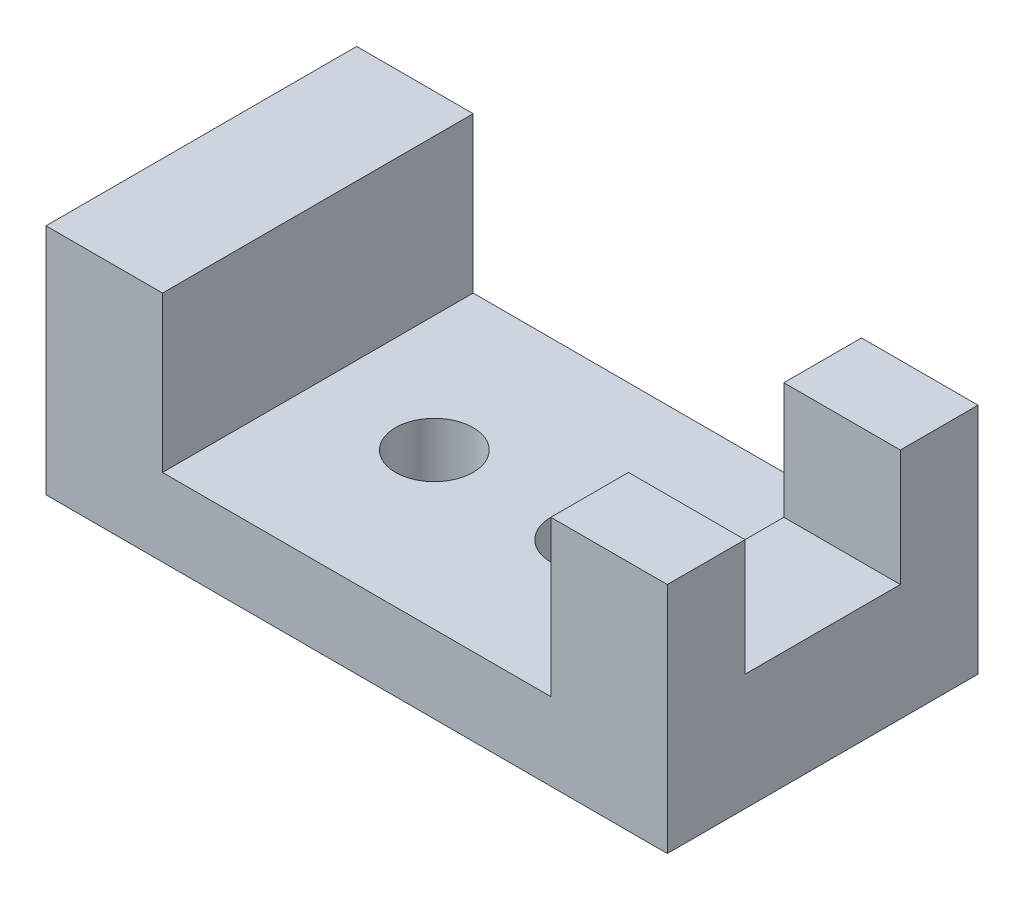
ISO-10303-21;
HEADER;
FILE_DESCRIPTION(('STEP AP214'),'2;1');
FILE_NAME('part.step','',(''),(''),'','','');
FILE_SCHEMA(('AUTOMOTIVE_DESIGN { 1 0 10303 214 1 1 1 1 }'));
ENDSEC;
DATA;
#1=APPLICATION_CONTEXT('core data for automotive mechanical design processes');
#2=APPLICATION_PROTOCOL_DEFINITION('international standard','automotive_design',2000,#1);
#3=PRODUCT_CONTEXT('',#1,'mechanical');
#4=PRODUCT('Part','Part','',(#3));
#5=PRODUCT_RELATED_PRODUCT_CATEGORY('part','',(#4));
#6=PRODUCT_DEFINITION_FORMATION('','',#4);
#7=PRODUCT_DEFINITION_CONTEXT('part definition',#1,'design');
#8=PRODUCT_DEFINITION('design','',#6,#7);
#9=PRODUCT_DEFINITION_SHAPE('','',#8);
#10=(LENGTH_UNIT() NAMED_UNIT(*) SI_UNIT(.MILLI.,.METRE.));
#11=(NAMED_UNIT(*) PLANE_ANGLE_UNIT() SI_UNIT($,.RADIAN.));
#12=(NAMED_UNIT(*) SI_UNIT($,.STERADIAN.) SOLID_ANGLE_UNIT());
#13=UNCERTAINTY_MEASURE_WITH_UNIT(LENGTH_MEASURE(1.E-05),#10,'distance_accuracy_value','');
#14=(GEOMETRIC_REPRESENTATION_CONTEXT(3) GLOBAL_UNCERTAINTY_ASSIGNED_CONTEXT((#13)) GLOBAL_UNIT_ASSIGNED_CONTEXT((#10,
#11,#12)) REPRESENTATION_CONTEXT('',''));
#15=CARTESIAN_POINT('',(0.,0.,0.));
#16=DIRECTION('',(0.,0.,1.));
#17=DIRECTION('',(1.,0.,0.));
#18=AXIS2_PLACEMENT_3D('',#15,#16,#17);
#19=CARTESIAN_POINT('',(0.,30.,13.5562625586068));
#20=DIRECTION('',(0.,0.,-1.));
#21=DIRECTION('',(-1.,0.,0.));
#22=AXIS2_PLACEMENT_3D('',#19,#20,#21);
#23=PLANE('',#22);
#24=DIRECTION('',(1.,0.,0.));
#25=VECTOR('',#24,1.);
#26=CARTESIAN_POINT('',(0.,0.,13.5562625586068));
#27=LINE('',#26,#25);
#28=CARTESIAN_POINT('',(-51.0683188211654,0.,13.5562625586068));
#29=VERTEX_POINT('',#28);
#30=CARTESIAN_POINT('',(28.9316811788346,0.,13.5562625586068));
#31=VERTEX_POINT('',#30);
#32=EDGE_CURVE('E203',#29,#31,#27,.T.);
#33=ORIENTED_EDGE('',*,*,#32,.F.);
#34=DIRECTION('',(0.,-1.,0.));
#35=VECTOR('',#34,1.);
#36=CARTESIAN_POINT('',(-51.0683188211654,30.,13.5562625586068));
#37=LINE('',#36,#35);
#38=CARTESIAN_POINT('',(-51.0683188211654,30.,13.5562625586068));
#39=VERTEX_POINT('',#38);
#40=EDGE_CURVE('E11',#39,#29,#37,.T.);
#41=ORIENTED_EDGE('',*,*,#40,.F.);
#42=DIRECTION('',(1.,0.,0.));
#43=VECTOR('',#42,1.);
#44=CARTESIAN_POINT('',(0.,30.,13.5562625586068));
#45=LINE('',#44,#43);
#46=CARTESIAN_POINT('',(-36.0683188211654,30.,13.5562625586068));
#47=VERTEX_POINT('',#46);
#48=EDGE_CURVE('E208',#39,#47,#45,.T.);
#49=ORIENTED_EDGE('',*,*,#48,.T.);
#50=DIRECTION('',(0.,-1.,0.));
#51=VECTOR('',#50,1.);
#52=CARTESIAN_POINT('',(-36.0683188211654,30.,13.5562625586068));
#53=LINE('',#52,#51);
#54=CARTESIAN_POINT('',(-36.0683188211654,10.,13.5562625586068));
#55=VERTEX_POINT('',#54);
#56=EDGE_CURVE('E52',#47,#55,#53,.T.);
#57=ORIENTED_EDGE('',*,*,#56,.T.);
#58=DIRECTION('',(1.,0.,0.));
#59=VECTOR('',#58,1.);
#60=CARTESIAN_POINT('',(0.,10.,13.5562625586068));
#61=LINE('',#60,#59);
#62=CARTESIAN_POINT('',(13.9316811788346,10.,13.5562625586068));
#63=VERTEX_POINT('',#62);
#64=EDGE_CURVE('E197',#55,#63,#61,.T.);
#65=ORIENTED_EDGE('',*,*,#64,.T.);
#66=DIRECTION('',(0.,-1.,0.));
#67=VECTOR('',#66,1.);
#68=CARTESIAN_POINT('',(13.9316811788346,30.,13.5562625586068));
#69=LINE('',#68,#67);
#70=CARTESIAN_POINT('',(13.9316811788346,30.,13.5562625586068));
#71=VERTEX_POINT('',#70);
#72=EDGE_CURVE('E235',#71,#63,#69,.T.);
#73=ORIENTED_EDGE('',*,*,#72,.F.);
#74=DIRECTION('',(1.,0.,0.));
#75=VECTOR('',#74,1.);
#76=CARTESIAN_POINT('',(0.,30.,13.5562625586068));
#77=LINE('',#76,#75);
#78=CARTESIAN_POINT('',(28.9316811788346,30.,13.5562625586068));
#79=VERTEX_POINT('',#78);
#80=EDGE_CURVE('E142',#71,#79,#77,.T.);
#81=ORIENTED_EDGE('',*,*,#80,.T.);
#82=DIRECTION('',(0.,-1.,0.));
#83=VECTOR('',#82,1.);
#84=CARTESIAN_POINT('',(28.9316811788346,30.,13.5562625586068));
#85=LINE('',#84,#83);
#86=EDGE_CURVE('E154',#79,#31,#85,.T.);
#87=ORIENTED_EDGE('',*,*,#86,.T.);
#88=EDGE_LOOP('',(#33,#41,#49,#57,#65,#73,#81,#87));
#89=FACE_BOUND('',#88,.T.);
#90=ADVANCED_FACE('F33',(#89),#23,.T.);
#91=CARTESIAN_POINT('',(-51.0683188211654,30.,0.));
#92=DIRECTION('',(-1.,0.,0.));
#93=DIRECTION('',(0.,0.,1.));
#94=AXIS2_PLACEMENT_3D('',#91,#92,#93);
#95=PLANE('',#94);
#96=DIRECTION('',(0.,0.,-1.));
#97=VECTOR('',#96,1.);
#98=CARTESIAN_POINT('',(-51.0683188211654,0.,0.));
#99=LINE('',#98,#97);
#100=CARTESIAN_POINT('',(-51.0683188211654,0.,53.5562625586068));
#101=VERTEX_POINT('',#100);
#102=EDGE_CURVE('E219',#101,#29,#99,.T.);
#103=ORIENTED_EDGE('',*,*,#102,.F.);
#104=DIRECTION('',(0.,-1.,0.));
#105=VECTOR('',#104,1.);
#106=CARTESIAN_POINT('',(-51.0683188211654,30.,53.5562625586068));
#107=LINE('',#106,#105);
#108=CARTESIAN_POINT('',(-51.0683188211654,30.,53.5562625586068));
#109=VERTEX_POINT('',#108);
#110=EDGE_CURVE('E40',#109,#101,#107,.T.);
#111=ORIENTED_EDGE('',*,*,#110,.F.);
#112=DIRECTION('',(0.,0.,-1.));
#113=VECTOR('',#112,1.);
#114=CARTESIAN_POINT('',(-51.0683188211654,30.,0.));
#115=LINE('',#114,#113);
#116=EDGE_CURVE('E210',#109,#39,#115,.T.);
#117=ORIENTED_EDGE('',*,*,#116,.T.);
#118=ORIENTED_EDGE('',*,*,#40,.T.);
#119=EDGE_LOOP('',(#103,#111,#117,#118));
#120=FACE_BOUND('',#119,.T.);
#121=ADVANCED_FACE('F249',(#120),#95,.T.);
#122=CARTESIAN_POINT('',(0.,30.,53.5562625586068));
#123=DIRECTION('',(0.,0.,-1.));
#124=DIRECTION('',(-1.,0.,0.));
#125=AXIS2_PLACEMENT_3D('',#122,#123,#124);
#126=PLANE('',#125);
#127=DIRECTION('',(1.,0.,0.));
#128=VECTOR('',#127,1.);
#129=CARTESIAN_POINT('',(0.,0.,53.5562625586068));
#130=LINE('',#129,#128);
#131=CARTESIAN_POINT('',(28.9316811788346,0.,53.5562625586068));
#132=VERTEX_POINT('',#131);
#133=EDGE_CURVE('E211',#101,#132,#130,.T.);
#134=ORIENTED_EDGE('',*,*,#133,.T.);
#135=DIRECTION('',(0.,-1.,0.));
#136=VECTOR('',#135,1.);
#137=CARTESIAN_POINT('',(28.9316811788346,30.,53.5562625586068));
#138=LINE('',#137,#136);
#139=CARTESIAN_POINT('',(28.9316811788346,30.,53.5562625586068));
#140=VERTEX_POINT('',#139);
#141=EDGE_CURVE('E178',#140,#132,#138,.T.);
#142=ORIENTED_EDGE('',*,*,#141,.F.);
#143=DIRECTION('',(1.,0.,0.));
#144=VECTOR('',#143,1.);
#145=CARTESIAN_POINT('',(0.,30.,53.5562625586068));
#146=LINE('',#145,#144);
#147=CARTESIAN_POINT('',(13.9316811788346,30.,53.5562625586068));
#148=VERTEX_POINT('',#147);
#149=EDGE_CURVE('E170',#148,#140,#146,.T.);
#150=ORIENTED_EDGE('',*,*,#149,.F.);
#151=DIRECTION('',(0.,-1.,0.));
#152=VECTOR('',#151,1.);
#153=CARTESIAN_POINT('',(13.9316811788346,30.,53.5562625586068));
#154=LINE('',#153,#152);
#155=CARTESIAN_POINT('',(13.9316811788346,10.,53.5562625586068));
#156=VERTEX_POINT('',#155);
#157=EDGE_CURVE('E181',#148,#156,#154,.T.);
#158=ORIENTED_EDGE('',*,*,#157,.T.);
#159=DIRECTION('',(1.,0.,0.));
#160=VECTOR('',#159,1.);
#161=CARTESIAN_POINT('',(0.,10.,53.5562625586068));
#162=LINE('',#161,#160);
#163=CARTESIAN_POINT('',(-36.0683188211654,10.,53.5562625586068));
#164=VERTEX_POINT('',#163);
#165=EDGE_CURVE('E201',#164,#156,#162,.T.);
#166=ORIENTED_EDGE('',*,*,#165,.F.);
#167=DIRECTION('',(0.,-1.,0.));
#168=VECTOR('',#167,1.);
#169=CARTESIAN_POINT('',(-36.0683188211654,30.,53.5562625586068));
#170=LINE('',#169,#168);
#171=CARTESIAN_POINT('',(-36.0683188211654,30.,53.5562625586068));
#172=VERTEX_POINT('',#171);
#173=EDGE_CURVE('E224',#172,#164,#170,.T.);
#174=ORIENTED_EDGE('',*,*,#173,.F.);
#175=DIRECTION('',(1.,0.,0.));
#176=VECTOR('',#175,1.);
#177=CARTESIAN_POINT('',(0.,30.,53.5562625586068));
#178=LINE('',#177,#176);
#179=EDGE_CURVE('E214',#109,#172,#178,.T.);
#180=ORIENTED_EDGE('',*,*,#179,.F.);
#181=ORIENTED_EDGE('',*,*,#110,.T.);
#182=EDGE_LOOP('',(#134,#142,#150,#158,#166,#174,#180,#181));
#183=FACE_BOUND('',#182,.T.);
#184=ADVANCED_FACE('F229',(#183),#126,.F.);
#185=CARTESIAN_POINT('',(-36.0683188211654,30.,0.));
#186=DIRECTION('',(1.,0.,0.));
#187=DIRECTION('',(0.,0.,-1.));
#188=AXIS2_PLACEMENT_3D('',#185,#186,#187);
#189=PLANE('',#188);
#190=DIRECTION('',(0.,0.,1.));
#191=VECTOR('',#190,1.);
#192=CARTESIAN_POINT('',(-36.0683188211654,10.,0.));
#193=LINE('',#192,#191);
#194=EDGE_CURVE('E47',#55,#164,#193,.T.);
#195=ORIENTED_EDGE('',*,*,#194,.F.);
#196=ORIENTED_EDGE('',*,*,#56,.F.);
#197=DIRECTION('',(0.,0.,1.));
#198=VECTOR('',#197,1.);
#199=CARTESIAN_POINT('',(-36.0683188211654,30.,0.));
#200=LINE('',#199,#198);
#201=EDGE_CURVE('E216',#47,#172,#200,.T.);
#202=ORIENTED_EDGE('',*,*,#201,.T.);
#203=ORIENTED_EDGE('',*,*,#173,.T.);
#204=EDGE_LOOP('',(#195,#196,#202,#203));
#205=FACE_BOUND('',#204,.T.);
#206=ADVANCED_FACE('F227',(#205),#189,.T.);
#207=CARTESIAN_POINT('',(0.,30.,0.));
#208=DIRECTION('',(0.,1.,0.));
#209=DIRECTION('',(0.,0.,1.));
#210=AXIS2_PLACEMENT_3D('',#207,#208,#209);
#211=PLANE('',#210);
#212=ORIENTED_EDGE('',*,*,#48,.F.);
#213=ORIENTED_EDGE('',*,*,#116,.F.);
#214=ORIENTED_EDGE('',*,*,#179,.T.);
#215=ORIENTED_EDGE('',*,*,#201,.F.);
#216=EDGE_LOOP('',(#212,#213,#214,#215));
#217=FACE_BOUND('',#216,.T.);
#218=ADVANCED_FACE('F252',(#217),#211,.T.);
#219=CARTESIAN_POINT('',(0.,0.,0.));
#220=DIRECTION('',(0.,1.,0.));
#221=DIRECTION('',(0.,0.,1.));
#222=AXIS2_PLACEMENT_3D('',#219,#220,#221);
#223=PLANE('',#222);
#224=ORIENTED_EDGE('',*,*,#32,.T.);
#225=DIRECTION('',(0.,0.,-1.));
#226=VECTOR('',#225,1.);
#227=CARTESIAN_POINT('',(28.9316811788346,0.,0.));
#228=LINE('',#227,#226);
#229=EDGE_CURVE('E164',#132,#31,#228,.T.);
#230=ORIENTED_EDGE('',*,*,#229,.F.);
#231=ORIENTED_EDGE('',*,*,#133,.F.);
#232=ORIENTED_EDGE('',*,*,#102,.T.);
#233=EDGE_LOOP('',(#224,#230,#231,#232));
#234=FACE_BOUND('',#233,.T.);
#235=CARTESIAN_POINT('',(-1.06831882116544,0.,33.5562625586068));
#236=DIRECTION('',(0.,1.,0.));
#237=DIRECTION('',(0.,0.,1.));
#238=AXIS2_PLACEMENT_3D('',#235,#236,#237);
#239=CIRCLE('',#238,5.);
#240=CARTESIAN_POINT('',(-1.06831882116544,0.,38.5562625586068));
#241=VERTEX_POINT('',#240);
#242=EDGE_CURVE('E186',#241,#241,#239,.T.);
#243=ORIENTED_EDGE('',*,*,#242,.T.);
#244=EDGE_LOOP('',(#243));
#245=FACE_BOUND('',#244,.T.);
#246=CARTESIAN_POINT('',(-21.0683188211654,0.,33.5562625586068));
#247=DIRECTION('',(0.,1.,0.));
#248=DIRECTION('',(0.,0.,1.));
#249=AXIS2_PLACEMENT_3D('',#246,#247,#248);
#250=CIRCLE('',#249,5.);
#251=CARTESIAN_POINT('',(-21.0683188211654,0.,38.5562625586068));
#252=VERTEX_POINT('',#251);
#253=EDGE_CURVE('E191',#252,#252,#250,.T.);
#254=ORIENTED_EDGE('',*,*,#253,.T.);
#255=EDGE_LOOP('',(#254));
#256=FACE_BOUND('',#255,.T.);
#257=ADVANCED_FACE('F246',(#234,#245,#256),#223,.F.);
#258=CARTESIAN_POINT('',(-21.0683188211654,10.,33.5562625586068));
#259=DIRECTION('',(0.,-1.,0.));
#260=DIRECTION('',(0.,0.,-1.));
#261=AXIS2_PLACEMENT_3D('',#258,#259,#260);
#262=CYLINDRICAL_SURFACE('',#261,5.);
#263=CARTESIAN_POINT('',(-21.0683188211654,10.,33.5562625586068));
#264=DIRECTION('',(0.,1.,0.));
#265=DIRECTION('',(0.,0.,1.));
#266=AXIS2_PLACEMENT_3D('',#263,#264,#265);
#267=CIRCLE('',#266,5.);
#268=CARTESIAN_POINT('',(-21.0683188211654,10.,38.5562625586068));
#269=VERTEX_POINT('',#268);
#270=EDGE_CURVE('E190',#269,#269,#267,.T.);
#271=ORIENTED_EDGE('',*,*,#270,.T.);
#272=EDGE_LOOP('',(#271));
#273=FACE_BOUND('',#272,.T.);
#274=ORIENTED_EDGE('',*,*,#253,.F.);
#275=EDGE_LOOP('',(#274));
#276=FACE_BOUND('',#275,.T.);
#277=ADVANCED_FACE('F259',(#273,#276),#262,.F.);
#278=CARTESIAN_POINT('',(-1.06831882116544,10.,33.5562625586068));
#279=DIRECTION('',(0.,-1.,0.));
#280=DIRECTION('',(0.,0.,-1.));
#281=AXIS2_PLACEMENT_3D('',#278,#279,#280);
#282=CYLINDRICAL_SURFACE('',#281,5.);
#283=CARTESIAN_POINT('',(-1.06831882116544,10.,33.5562625586068));
#284=DIRECTION('',(0.,1.,0.));
#285=DIRECTION('',(0.,0.,1.));
#286=AXIS2_PLACEMENT_3D('',#283,#284,#285);
#287=CIRCLE('',#286,5.);
#288=CARTESIAN_POINT('',(-1.06831882116544,10.,38.5562625586068));
#289=VERTEX_POINT('',#288);
#290=EDGE_CURVE('E187',#289,#289,#287,.T.);
#291=ORIENTED_EDGE('',*,*,#290,.T.);
#292=EDGE_LOOP('',(#291));
#293=FACE_BOUND('',#292,.T.);
#294=ORIENTED_EDGE('',*,*,#242,.F.);
#295=EDGE_LOOP('',(#294));
#296=FACE_BOUND('',#295,.T.);
#297=ADVANCED_FACE('F295',(#293,#296),#282,.F.);
#298=CARTESIAN_POINT('',(0.,10.,0.));
#299=DIRECTION('',(0.,1.,0.));
#300=DIRECTION('',(0.,0.,1.));
#301=AXIS2_PLACEMENT_3D('',#298,#299,#300);
#302=PLANE('',#301);
#303=ORIENTED_EDGE('',*,*,#290,.F.);
#304=EDGE_LOOP('',(#303));
#305=FACE_BOUND('',#304,.T.);
#306=ORIENTED_EDGE('',*,*,#270,.F.);
#307=EDGE_LOOP('',(#306));
#308=FACE_BOUND('',#307,.T.);
#309=DIRECTION('',(0.,0.,1.));
#310=VECTOR('',#309,1.);
#311=CARTESIAN_POINT('',(13.9316811788346,10.,0.));
#312=LINE('',#311,#310);
#313=EDGE_CURVE('E194',#63,#156,#312,.T.);
#314=ORIENTED_EDGE('',*,*,#313,.F.);
#315=ORIENTED_EDGE('',*,*,#64,.F.);
#316=ORIENTED_EDGE('',*,*,#194,.T.);
#317=ORIENTED_EDGE('',*,*,#165,.T.);
#318=EDGE_LOOP('',(#314,#315,#316,#317));
#319=FACE_BOUND('',#318,.T.);
#320=ADVANCED_FACE('F234',(#305,#308,#319),#302,.T.);
#321=CARTESIAN_POINT('',(13.9316811788346,30.,0.));
#322=DIRECTION('',(1.,0.,0.));
#323=DIRECTION('',(0.,0.,-1.));
#324=AXIS2_PLACEMENT_3D('',#321,#322,#323);
#325=PLANE('',#324);
#326=ORIENTED_EDGE('',*,*,#72,.T.);
#327=ORIENTED_EDGE('',*,*,#313,.T.);
#328=ORIENTED_EDGE('',*,*,#157,.F.);
#329=DIRECTION('',(0.,0.,1.));
#330=VECTOR('',#329,1.);
#331=CARTESIAN_POINT('',(13.9316811788346,30.,0.));
#332=LINE('',#331,#330);
#333=CARTESIAN_POINT('',(13.9316811788346,30.,43.5562625586068));
#334=VERTEX_POINT('',#333);
#335=EDGE_CURVE('E168',#334,#148,#332,.T.);
#336=ORIENTED_EDGE('',*,*,#335,.F.);
#337=DIRECTION('',(0.,-1.,0.));
#338=VECTOR('',#337,1.);
#339=CARTESIAN_POINT('',(13.9316811788346,30.,43.5562625586068));
#340=LINE('',#339,#338);
#341=CARTESIAN_POINT('',(13.9316811788346,15.,43.5562625586068));
#342=VERTEX_POINT('',#341);
#343=EDGE_CURVE('E184',#334,#342,#340,.T.);
#344=ORIENTED_EDGE('',*,*,#343,.T.);
#345=DIRECTION('',(0.,0.,1.));
#346=VECTOR('',#345,1.);
#347=CARTESIAN_POINT('',(13.9316811788346,15.,0.));
#348=LINE('',#347,#346);
#349=CARTESIAN_POINT('',(13.9316811788346,15.,23.5562625586068));
#350=VERTEX_POINT('',#349);
#351=EDGE_CURVE('E149',#350,#342,#348,.T.);
#352=ORIENTED_EDGE('',*,*,#351,.F.);
#353=DIRECTION('',(0.,-1.,0.));
#354=VECTOR('',#353,1.);
#355=CARTESIAN_POINT('',(13.9316811788346,30.,23.5562625586068));
#356=LINE('',#355,#354);
#357=CARTESIAN_POINT('',(13.9316811788346,30.,23.5562625586068));
#358=VERTEX_POINT('',#357);
#359=EDGE_CURVE('E130',#358,#350,#356,.T.);
#360=ORIENTED_EDGE('',*,*,#359,.F.);
#361=DIRECTION('',(0.,0.,1.));
#362=VECTOR('',#361,1.);
#363=CARTESIAN_POINT('',(13.9316811788346,30.,0.));
#364=LINE('',#363,#362);
#365=EDGE_CURVE('E136',#71,#358,#364,.T.);
#366=ORIENTED_EDGE('',*,*,#365,.F.);
#367=EDGE_LOOP('',(#326,#327,#328,#336,#344,#352,#360,#366));
#368=FACE_BOUND('',#367,.T.);
#369=ADVANCED_FACE('F146',(#368),#325,.F.);
#370=CARTESIAN_POINT('',(0.,30.,43.5562625586068));
#371=DIRECTION('',(0.,0.,-1.));
#372=DIRECTION('',(-1.,0.,0.));
#373=AXIS2_PLACEMENT_3D('',#370,#371,#372);
#374=PLANE('',#373);
#375=DIRECTION('',(1.,0.,0.));
#376=VECTOR('',#375,1.);
#377=CARTESIAN_POINT('',(0.,15.,43.5562625586068));
#378=LINE('',#377,#376);
#379=CARTESIAN_POINT('',(28.9316811788346,15.,43.5562625586068));
#380=VERTEX_POINT('',#379);
#381=EDGE_CURVE('E159',#342,#380,#378,.T.);
#382=ORIENTED_EDGE('',*,*,#381,.F.);
#383=ORIENTED_EDGE('',*,*,#343,.F.);
#384=DIRECTION('',(1.,0.,0.));
#385=VECTOR('',#384,1.);
#386=CARTESIAN_POINT('',(0.,30.,43.5562625586068));
#387=LINE('',#386,#385);
#388=CARTESIAN_POINT('',(28.9316811788346,30.,43.5562625586068));
#389=VERTEX_POINT('',#388);
#390=EDGE_CURVE('E165',#334,#389,#387,.T.);
#391=ORIENTED_EDGE('',*,*,#390,.T.);
#392=DIRECTION('',(0.,-1.,0.));
#393=VECTOR('',#392,1.);
#394=CARTESIAN_POINT('',(28.9316811788346,30.,43.5562625586068));
#395=LINE('',#394,#393);
#396=EDGE_CURVE('E174',#389,#380,#395,.T.);
#397=ORIENTED_EDGE('',*,*,#396,.T.);
#398=EDGE_LOOP('',(#382,#383,#391,#397));
#399=FACE_BOUND('',#398,.T.);
#400=ADVANCED_FACE('F322',(#399),#374,.T.);
#401=CARTESIAN_POINT('',(28.9316811788346,30.,0.));
#402=DIRECTION('',(-1.,0.,0.));
#403=DIRECTION('',(0.,0.,1.));
#404=AXIS2_PLACEMENT_3D('',#401,#402,#403);
#405=PLANE('',#404);
#406=ORIENTED_EDGE('',*,*,#229,.T.);
#407=ORIENTED_EDGE('',*,*,#86,.F.);
#408=DIRECTION('',(0.,0.,-1.));
#409=VECTOR('',#408,1.);
#410=CARTESIAN_POINT('',(28.9316811788346,30.,0.));
#411=LINE('',#410,#409);
#412=CARTESIAN_POINT('',(28.9316811788346,30.,23.5562625586068));
#413=VERTEX_POINT('',#412);
#414=EDGE_CURVE('E135',#413,#79,#411,.T.);
#415=ORIENTED_EDGE('',*,*,#414,.F.);
#416=DIRECTION('',(0.,-1.,0.));
#417=VECTOR('',#416,1.);
#418=CARTESIAN_POINT('',(28.9316811788346,30.,23.5562625586068));
#419=LINE('',#418,#417);
#420=CARTESIAN_POINT('',(28.9316811788346,15.,23.5562625586068));
#421=VERTEX_POINT('',#420);
#422=EDGE_CURVE('E132',#413,#421,#419,.T.);
#423=ORIENTED_EDGE('',*,*,#422,.T.);
#424=DIRECTION('',(0.,0.,-1.));
#425=VECTOR('',#424,1.);
#426=CARTESIAN_POINT('',(28.9316811788346,15.,0.));
#427=LINE('',#426,#425);
#428=EDGE_CURVE('E162',#380,#421,#427,.T.);
#429=ORIENTED_EDGE('',*,*,#428,.F.);
#430=ORIENTED_EDGE('',*,*,#396,.F.);
#431=DIRECTION('',(0.,0.,-1.));
#432=VECTOR('',#431,1.);
#433=CARTESIAN_POINT('',(28.9316811788346,30.,0.));
#434=LINE('',#433,#432);
#435=EDGE_CURVE('E172',#140,#389,#434,.T.);
#436=ORIENTED_EDGE('',*,*,#435,.F.);
#437=ORIENTED_EDGE('',*,*,#141,.T.);
#438=EDGE_LOOP('',(#406,#407,#415,#423,#429,#430,#436,#437));
#439=FACE_BOUND('',#438,.T.);
#440=ADVANCED_FACE('F242',(#439),#405,.F.);
#441=CARTESIAN_POINT('',(0.,30.,0.));
#442=DIRECTION('',(0.,1.,0.));
#443=DIRECTION('',(0.,0.,1.));
#444=AXIS2_PLACEMENT_3D('',#441,#442,#443);
#445=PLANE('',#444);
#446=ORIENTED_EDGE('',*,*,#390,.F.);
#447=ORIENTED_EDGE('',*,*,#335,.T.);
#448=ORIENTED_EDGE('',*,*,#149,.T.);
#449=ORIENTED_EDGE('',*,*,#435,.T.);
#450=EDGE_LOOP('',(#446,#447,#448,#449));
#451=FACE_BOUND('',#450,.T.);
#452=ADVANCED_FACE('F343',(#451),#445,.T.);
#453=CARTESIAN_POINT('',(0.,15.,0.));
#454=DIRECTION('',(0.,1.,0.));
#455=DIRECTION('',(0.,0.,1.));
#456=AXIS2_PLACEMENT_3D('',#453,#454,#455);
#457=PLANE('',#456);
#458=DIRECTION('',(1.,0.,0.));
#459=VECTOR('',#458,1.);
#460=CARTESIAN_POINT('',(0.,15.,23.5562625586068));
#461=LINE('',#460,#459);
#462=EDGE_CURVE('E151',#350,#421,#461,.T.);
#463=ORIENTED_EDGE('',*,*,#462,.F.);
#464=ORIENTED_EDGE('',*,*,#351,.T.);
#465=ORIENTED_EDGE('',*,*,#381,.T.);
#466=ORIENTED_EDGE('',*,*,#428,.T.);
#467=EDGE_LOOP('',(#463,#464,#465,#466));
#468=FACE_BOUND('',#467,.T.);
#469=ADVANCED_FACE('F353',(#468),#457,.T.);
#470=CARTESIAN_POINT('',(0.,30.,23.5562625586068));
#471=DIRECTION('',(0.,0.,-1.));
#472=DIRECTION('',(-1.,0.,0.));
#473=AXIS2_PLACEMENT_3D('',#470,#471,#472);
#474=PLANE('',#473);
#475=ORIENTED_EDGE('',*,*,#359,.T.);
#476=ORIENTED_EDGE('',*,*,#462,.T.);
#477=ORIENTED_EDGE('',*,*,#422,.F.);
#478=DIRECTION('',(1.,0.,0.));
#479=VECTOR('',#478,1.);
#480=CARTESIAN_POINT('',(0.,30.,23.5562625586068));
#481=LINE('',#480,#479);
#482=EDGE_CURVE('E125',#358,#413,#481,.T.);
#483=ORIENTED_EDGE('',*,*,#482,.F.);
#484=EDGE_LOOP('',(#475,#476,#477,#483));
#485=FACE_BOUND('',#484,.T.);
#486=ADVANCED_FACE('F127',(#485),#474,.F.);
#487=CARTESIAN_POINT('',(0.,30.,0.));
#488=DIRECTION('',(0.,1.,0.));
#489=DIRECTION('',(0.,0.,1.));
#490=AXIS2_PLACEMENT_3D('',#487,#488,#489);
#491=PLANE('',#490);
#492=ORIENTED_EDGE('',*,*,#365,.T.);
#493=ORIENTED_EDGE('',*,*,#482,.T.);
#494=ORIENTED_EDGE('',*,*,#414,.T.);
#495=ORIENTED_EDGE('',*,*,#80,.F.);
#496=EDGE_LOOP('',(#492,#493,#494,#495));
#497=FACE_BOUND('',#496,.T.);
#498=ADVANCED_FACE('F140',(#497),#491,.T.);
#499=CLOSED_SHELL('',(#90,#121,#184,#206,#218,#257,#277,#297,#320,#369,#400,#440,#452,#469,#486,#498));
#500=MANIFOLD_SOLID_BREP('B2',#499);
#501=ADVANCED_BREP_SHAPE_REPRESENTATION('',(#18,#500),#14);
#502=SHAPE_DEFINITION_REPRESENTATION(#9,#501);
ENDSEC;
END-ISO-10303-21;
